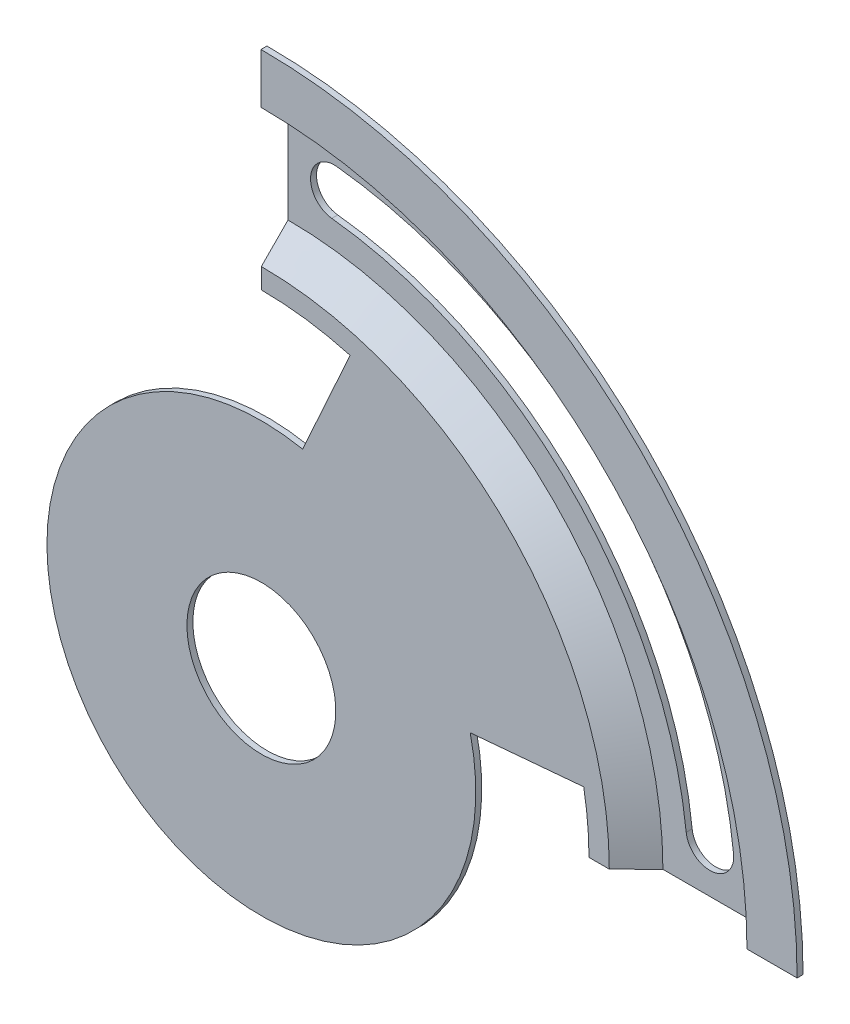
ISO-10303-21;
HEADER;
FILE_DESCRIPTION(('STEP AP214'),'2;1');
FILE_NAME('part.step','',(''),(''),'','','');
FILE_SCHEMA(('AUTOMOTIVE_DESIGN { 1 0 10303 214 1 1 1 1 }'));
ENDSEC;
DATA;
#1=APPLICATION_CONTEXT('core data for automotive mechanical design processes');
#2=APPLICATION_PROTOCOL_DEFINITION('international standard','automotive_design',2000,#1);
#3=PRODUCT_CONTEXT('',#1,'mechanical');
#4=PRODUCT('Part','Part','',(#3));
#5=PRODUCT_RELATED_PRODUCT_CATEGORY('part','',(#4));
#6=PRODUCT_DEFINITION_FORMATION('','',#4);
#7=PRODUCT_DEFINITION_CONTEXT('part definition',#1,'design');
#8=PRODUCT_DEFINITION('design','',#6,#7);
#9=PRODUCT_DEFINITION_SHAPE('','',#8);
#10=(LENGTH_UNIT() NAMED_UNIT(*) SI_UNIT(.MILLI.,.METRE.));
#11=(NAMED_UNIT(*) PLANE_ANGLE_UNIT() SI_UNIT($,.RADIAN.));
#12=(NAMED_UNIT(*) SI_UNIT($,.STERADIAN.) SOLID_ANGLE_UNIT());
#13=UNCERTAINTY_MEASURE_WITH_UNIT(LENGTH_MEASURE(1.E-05),#10,'distance_accuracy_value','');
#14=(GEOMETRIC_REPRESENTATION_CONTEXT(3) GLOBAL_UNCERTAINTY_ASSIGNED_CONTEXT((#13)) GLOBAL_UNIT_ASSIGNED_CONTEXT((#10,
#11,#12)) REPRESENTATION_CONTEXT('',''));
#15=CARTESIAN_POINT('',(0.,0.,0.));
#16=DIRECTION('',(0.,0.,1.));
#17=DIRECTION('',(1.,0.,0.));
#18=AXIS2_PLACEMENT_3D('',#15,#16,#17);
#19=CARTESIAN_POINT('',(-74.2716777212826,74.2716777212823,14.2371794871795));
#20=DIRECTION('',(0.,0.,1.));
#21=DIRECTION('',(1.,0.,0.));
#22=AXIS2_PLACEMENT_3D('',#19,#20,#21);
#23=PLANE('',#22);
#24=CARTESIAN_POINT('',(-74.2716777212823,0.,14.2371794871795));
#25=DIRECTION('',(0.,0.,-1.));
#26=DIRECTION('',(-1.,0.,0.));
#27=AXIS2_PLACEMENT_3D('',#24,#25,#26);
#28=CIRCLE('',#27,77.1120746125061);
#29=CARTESIAN_POINT('',(-74.2716777212826,77.1120746125061,14.2371794871795));
#30=VERTEX_POINT('',#29);
#31=CARTESIAN_POINT('',(2.84039689122376,0.,14.2371794871795));
#32=VERTEX_POINT('',#31);
#33=EDGE_CURVE('E216',#30,#32,#28,.T.);
#34=ORIENTED_EDGE('',*,*,#33,.F.);
#35=DIRECTION('',(0.,-1.,0.));
#36=VECTOR('',#35,1.);
#37=CARTESIAN_POINT('',(-74.2716777212826,74.2716777212823,14.2371794871795));
#38=LINE('',#37,#36);
#39=CARTESIAN_POINT('',(-74.2716777212826,62.940512664491,14.2371794871795));
#40=VERTEX_POINT('',#39);
#41=EDGE_CURVE('E268',#30,#40,#38,.T.);
#42=ORIENTED_EDGE('',*,*,#41,.T.);
#43=CARTESIAN_POINT('',(-74.2716777212823,0.,14.2371794871795));
#44=DIRECTION('',(0.,0.,-1.));
#45=DIRECTION('',(-1.,0.,0.));
#46=AXIS2_PLACEMENT_3D('',#43,#44,#45);
#47=CIRCLE('',#46,62.940512664491);
#48=CARTESIAN_POINT('',(-11.3311650567913,0.,14.2371794871795));
#49=VERTEX_POINT('',#48);
#50=EDGE_CURVE('E213',#40,#49,#47,.T.);
#51=ORIENTED_EDGE('',*,*,#50,.T.);
#52=DIRECTION('',(-1.,0.,0.));
#53=VECTOR('',#52,1.);
#54=CARTESIAN_POINT('',(0.,0.,14.2371794871795));
#55=LINE('',#54,#53);
#56=EDGE_CURVE('E316',#32,#49,#55,.T.);
#57=ORIENTED_EDGE('',*,*,#56,.F.);
#58=EDGE_LOOP('',(#34,#42,#51,#57));
#59=FACE_BOUND('',#58,.T.);
#60=CARTESIAN_POINT('',(-74.2716777212824,0.,14.2371794871795));
#61=DIRECTION('',(0.,0.,1.));
#62=DIRECTION('',(1.,0.,0.));
#63=AXIS2_PLACEMENT_3D('',#60,#61,#62);
#64=CIRCLE('',#63,75.2533607990788);
#65=CARTESIAN_POINT('',(0.549212140260685,8.05622441862127,14.2371794871795));
#66=VERTEX_POINT('',#65);
#67=CARTESIAN_POINT('',(-66.2154533026613,74.820889861543,14.2371794871795));
#68=VERTEX_POINT('',#67);
#69=EDGE_CURVE('E384',#66,#68,#64,.T.);
#70=ORIENTED_EDGE('',*,*,#69,.F.);
#71=CARTESIAN_POINT('',(-3.44347065533568,7.78773298835838,14.2371794871795));
#72=DIRECTION('',(0.,0.,1.));
#73=DIRECTION('',(1.,0.,0.));
#74=AXIS2_PLACEMENT_3D('',#71,#72,#73);
#75=CIRCLE('',#74,4.00170008301169);
#76=CARTESIAN_POINT('',(-7.4211937682571,7.35032883736475,14.2371794871795));
#77=VERTEX_POINT('',#76);
#78=EDGE_CURVE('E377',#66,#77,#75,.F.);
#79=ORIENTED_EDGE('',*,*,#78,.T.);
#80=CARTESIAN_POINT('',(-74.2716777212824,0.,14.2371794871795));
#81=DIRECTION('',(0.,0.,1.));
#82=DIRECTION('',(1.,0.,0.));
#83=AXIS2_PLACEMENT_3D('',#80,#81,#82);
#84=CIRCLE('',#83,67.2533607990788);
#85=CARTESIAN_POINT('',(-66.9213488839178,66.8504839530253,14.2371794871795));
#86=VERTEX_POINT('',#85);
#87=EDGE_CURVE('E389',#77,#86,#84,.T.);
#88=ORIENTED_EDGE('',*,*,#87,.T.);
#89=CARTESIAN_POINT('',(-66.4839447329242,70.8282070659467,14.2371794871795));
#90=DIRECTION('',(0.,0.,1.));
#91=DIRECTION('',(1.,0.,0.));
#92=AXIS2_PLACEMENT_3D('',#89,#90,#91);
#93=CIRCLE('',#92,4.00170008301169);
#94=EDGE_CURVE('E189',#68,#86,#93,.T.);
#95=ORIENTED_EDGE('',*,*,#94,.F.);
#96=EDGE_LOOP('',(#70,#79,#88,#95));
#97=FACE_BOUND('',#96,.T.);
#98=ADVANCED_FACE('F41',(#59,#97),#23,.T.);
#99=CARTESIAN_POINT('',(-74.2716777212826,74.2716777212823,13.2371794871795));
#100=DIRECTION('',(0.,0.,1.));
#101=DIRECTION('',(1.,0.,0.));
#102=AXIS2_PLACEMENT_3D('',#99,#100,#101);
#103=PLANE('',#102);
#104=CARTESIAN_POINT('',(-74.2716777212823,0.,13.2371794871795));
#105=DIRECTION('',(0.,0.,-1.));
#106=DIRECTION('',(-1.,0.,0.));
#107=AXIS2_PLACEMENT_3D('',#104,#105,#106);
#108=CIRCLE('',#107,62.5302247298292);
#109=CARTESIAN_POINT('',(-74.2716777212826,62.5302247298293,13.2371794871795));
#110=VERTEX_POINT('',#109);
#111=CARTESIAN_POINT('',(-11.741452991453,0.,13.2371794871795));
#112=VERTEX_POINT('',#111);
#113=EDGE_CURVE('E234',#110,#112,#108,.T.);
#114=ORIENTED_EDGE('',*,*,#113,.F.);
#115=DIRECTION('',(0.,-1.,0.));
#116=VECTOR('',#115,1.);
#117=CARTESIAN_POINT('',(-74.2716777212826,74.2716777212823,13.2371794871795));
#118=LINE('',#117,#116);
#119=CARTESIAN_POINT('',(-74.2716777212826,77.5302247298293,13.2371794871796));
#120=VERTEX_POINT('',#119);
#121=EDGE_CURVE('E244',#120,#110,#118,.T.);
#122=ORIENTED_EDGE('',*,*,#121,.F.);
#123=CARTESIAN_POINT('',(-74.2716777212823,0.,13.2371794871796));
#124=DIRECTION('',(0.,0.,-1.));
#125=DIRECTION('',(-1.,0.,0.));
#126=AXIS2_PLACEMENT_3D('',#123,#124,#125);
#127=CIRCLE('',#126,77.5302247298292);
#128=CARTESIAN_POINT('',(3.25854700854697,0.,13.2371794871795));
#129=VERTEX_POINT('',#128);
#130=EDGE_CURVE('E231',#120,#129,#127,.T.);
#131=ORIENTED_EDGE('',*,*,#130,.T.);
#132=DIRECTION('',(-1.,0.,0.));
#133=VECTOR('',#132,1.);
#134=CARTESIAN_POINT('',(0.,0.,13.2371794871795));
#135=LINE('',#134,#133);
#136=EDGE_CURVE('E292',#129,#112,#135,.T.);
#137=ORIENTED_EDGE('',*,*,#136,.T.);
#138=EDGE_LOOP('',(#114,#122,#131,#137));
#139=FACE_BOUND('',#138,.T.);
#140=CARTESIAN_POINT('',(-3.44347065533568,7.78773298835838,13.2371794871795));
#141=DIRECTION('',(0.,0.,1.));
#142=DIRECTION('',(1.,0.,0.));
#143=AXIS2_PLACEMENT_3D('',#140,#141,#142);
#144=CIRCLE('',#143,4.00170008301169);
#145=CARTESIAN_POINT('',(0.549212140260671,8.05622441862128,13.2371794871795));
#146=VERTEX_POINT('',#145);
#147=CARTESIAN_POINT('',(-7.4211937682571,7.35032883736475,13.2371794871795));
#148=VERTEX_POINT('',#147);
#149=EDGE_CURVE('E11',#146,#148,#144,.F.);
#150=ORIENTED_EDGE('',*,*,#149,.F.);
#151=CARTESIAN_POINT('',(-74.2716777212824,0.,13.2371794871795));
#152=DIRECTION('',(0.,0.,1.));
#153=DIRECTION('',(1.,0.,0.));
#154=AXIS2_PLACEMENT_3D('',#151,#152,#153);
#155=CIRCLE('',#154,75.2533607990788);
#156=CARTESIAN_POINT('',(-66.2154533026613,74.820889861543,13.2371794871795));
#157=VERTEX_POINT('',#156);
#158=EDGE_CURVE('E50',#146,#157,#155,.T.);
#159=ORIENTED_EDGE('',*,*,#158,.T.);
#160=CARTESIAN_POINT('',(-66.4839447329242,70.8282070659467,13.2371794871795));
#161=DIRECTION('',(0.,0.,1.));
#162=DIRECTION('',(1.,0.,0.));
#163=AXIS2_PLACEMENT_3D('',#160,#161,#162);
#164=CIRCLE('',#163,4.00170008301169);
#165=CARTESIAN_POINT('',(-66.9213488839178,66.8504839530253,13.2371794871795));
#166=VERTEX_POINT('',#165);
#167=EDGE_CURVE('E181',#157,#166,#164,.T.);
#168=ORIENTED_EDGE('',*,*,#167,.T.);
#169=CARTESIAN_POINT('',(-74.2716777212824,0.,13.2371794871795));
#170=DIRECTION('',(0.,0.,1.));
#171=DIRECTION('',(1.,0.,0.));
#172=AXIS2_PLACEMENT_3D('',#169,#170,#171);
#173=CIRCLE('',#172,67.2533607990788);
#174=EDGE_CURVE('E175',#148,#166,#173,.T.);
#175=ORIENTED_EDGE('',*,*,#174,.F.);
#176=EDGE_LOOP('',(#150,#159,#168,#175));
#177=FACE_BOUND('',#176,.T.);
#178=ADVANCED_FACE('F195',(#139,#177),#103,.F.);
#179=CARTESIAN_POINT('',(-74.2716777212823,0.,17.7069547573503));
#180=DIRECTION('',(0.,0.,-1.));
#181=DIRECTION('',(-1.,0.,0.));
#182=AXIS2_PLACEMENT_3D('',#179,#180,#181);
#183=CYLINDRICAL_SURFACE('',#182,55.0000521120331);
#184=CARTESIAN_POINT('',(-74.2716777212823,0.,18.7069547573503));
#185=DIRECTION('',(0.,0.,-1.));
#186=DIRECTION('',(-1.,0.,0.));
#187=AXIS2_PLACEMENT_3D('',#184,#185,#186);
#188=CIRCLE('',#187,55.0000521120331);
#189=CARTESIAN_POINT('',(-20.1559547401785,9.82314911618428,18.7069547573502));
#190=VERTEX_POINT('',#189);
#191=CARTESIAN_POINT('',(-19.2716256092492,0.,18.7069547573502));
#192=VERTEX_POINT('',#191);
#193=EDGE_CURVE('E209',#190,#192,#188,.T.);
#194=ORIENTED_EDGE('',*,*,#193,.F.);
#195=DIRECTION('',(0.,0.,-1.));
#196=VECTOR('',#195,1.);
#197=CARTESIAN_POINT('',(-20.1559547401785,9.82314911618429,18.7069547573502));
#198=LINE('',#197,#196);
#199=CARTESIAN_POINT('',(-20.1559547401785,9.82314911618429,17.7069547573502));
#200=VERTEX_POINT('',#199);
#201=EDGE_CURVE('E344',#190,#200,#198,.T.);
#202=ORIENTED_EDGE('',*,*,#201,.T.);
#203=CARTESIAN_POINT('',(-74.2716777212823,0.,17.7069547573503));
#204=DIRECTION('',(0.,0.,-1.));
#205=DIRECTION('',(-1.,0.,0.));
#206=AXIS2_PLACEMENT_3D('',#203,#204,#205);
#207=CIRCLE('',#206,55.0000521120331);
#208=CARTESIAN_POINT('',(-19.2716256092492,0.,17.7069547573502));
#209=VERTEX_POINT('',#208);
#210=EDGE_CURVE('E204',#200,#209,#207,.T.);
#211=ORIENTED_EDGE('',*,*,#210,.T.);
#212=DIRECTION('',(0.,0.,1.));
#213=VECTOR('',#212,1.);
#214=CARTESIAN_POINT('',(-19.2716256092492,0.,0.));
#215=LINE('',#214,#213);
#216=EDGE_CURVE('E328',#209,#192,#215,.T.);
#217=ORIENTED_EDGE('',*,*,#216,.T.);
#218=EDGE_LOOP('',(#194,#202,#211,#217));
#219=FACE_BOUND('',#218,.T.);
#220=ADVANCED_FACE('F413',(#219),#183,.F.);
#221=CARTESIAN_POINT('',(-74.2716777212826,74.2716777212823,17.7069547573503));
#222=DIRECTION('',(0.,0.,1.));
#223=DIRECTION('',(1.,0.,0.));
#224=AXIS2_PLACEMENT_3D('',#221,#222,#223);
#225=PLANE('',#224);
#226=CARTESIAN_POINT('',(-74.2716777212825,55.0000521120331,17.7069547573503));
#227=VERTEX_POINT('',#226);
#228=CARTESIAN_POINT('',(-59.3717429626267,52.9433440246663,17.7069547573503));
#229=VERTEX_POINT('',#228);
#230=EDGE_CURVE('E182',#227,#229,#207,.T.);
#231=ORIENTED_EDGE('',*,*,#230,.F.);
#232=DIRECTION('',(0.,-1.,0.));
#233=VECTOR('',#232,1.);
#234=CARTESIAN_POINT('',(-74.2716777212826,74.2716777212823,17.7069547573503));
#235=LINE('',#234,#233);
#236=CARTESIAN_POINT('',(-74.2716777212825,58.0000521120331,17.7069547573503));
#237=VERTEX_POINT('',#236);
#238=EDGE_CURVE('E284',#237,#227,#235,.T.);
#239=ORIENTED_EDGE('',*,*,#238,.F.);
#240=CARTESIAN_POINT('',(-74.2716777212823,0.,17.7069547573503));
#241=DIRECTION('',(0.,0.,-1.));
#242=DIRECTION('',(-1.,0.,0.));
#243=AXIS2_PLACEMENT_3D('',#240,#241,#242);
#244=CIRCLE('',#243,58.0000521120331);
#245=CARTESIAN_POINT('',(-16.2716256092492,0.,17.7069547573502));
#246=VERTEX_POINT('',#245);
#247=EDGE_CURVE('E237',#237,#246,#244,.T.);
#248=ORIENTED_EDGE('',*,*,#247,.T.);
#249=DIRECTION('',(-1.,0.,0.));
#250=VECTOR('',#249,1.);
#251=CARTESIAN_POINT('',(0.,0.,17.7069547573502));
#252=LINE('',#251,#250);
#253=EDGE_CURVE('E332',#246,#209,#252,.T.);
#254=ORIENTED_EDGE('',*,*,#253,.T.);
#255=ORIENTED_EDGE('',*,*,#210,.F.);
#256=DIRECTION('',(-0.996200421618735,-0.0870902977756768,0.));
#257=VECTOR('',#256,1.);
#258=CARTESIAN_POINT('',(-39.2081045606857,8.15756319077519,17.7069547573503));
#259=LINE('',#258,#257);
#260=CARTESIAN_POINT('',(-39.2081045606857,8.15756319077519,17.7069547573503));
#261=VERTEX_POINT('',#260);
#262=EDGE_CURVE('E350',#200,#261,#259,.T.);
#263=ORIENTED_EDGE('',*,*,#262,.T.);
#264=CARTESIAN_POINT('',(-74.2716777212823,0.,17.7069547573503));
#265=DIRECTION('',(0.,0.,-1.));
#266=DIRECTION('',(-1.,0.,0.));
#267=AXIS2_PLACEMENT_3D('',#264,#265,#266);
#268=CIRCLE('',#267,36.);
#269=CARTESIAN_POINT('',(-67.3429790735951,35.3269463023559,17.7069547573503));
#270=VERTEX_POINT('',#269);
#271=EDGE_CURVE('E359',#261,#270,#268,.T.);
#272=ORIENTED_EDGE('',*,*,#271,.T.);
#273=DIRECTION('',(0.412250010118188,0.911070759687499,0.));
#274=VECTOR('',#273,1.);
#275=CARTESIAN_POINT('',(-67.3429790735951,35.3269463023559,17.7069547573503));
#276=LINE('',#275,#274);
#277=EDGE_CURVE('E355',#270,#229,#276,.T.);
#278=ORIENTED_EDGE('',*,*,#277,.T.);
#279=EDGE_LOOP('',(#231,#239,#248,#254,#255,#263,#272,#278));
#280=FACE_BOUND('',#279,.T.);
#281=CARTESIAN_POINT('',(-74.2716777212823,0.,17.7069547573503));
#282=DIRECTION('',(0.,0.,-1.));
#283=DIRECTION('',(-1.,0.,0.));
#284=AXIS2_PLACEMENT_3D('',#281,#282,#283);
#285=CIRCLE('',#284,12.5);
#286=CARTESIAN_POINT('',(-86.7716777212823,0.,17.7069547573503));
#287=VERTEX_POINT('',#286);
#288=EDGE_CURVE('E373',#287,#287,#285,.T.);
#289=ORIENTED_EDGE('',*,*,#288,.F.);
#290=EDGE_LOOP('',(#289));
#291=FACE_BOUND('',#290,.T.);
#292=ADVANCED_FACE('F429',(#280,#291),#225,.F.);
#293=ORIENTED_EDGE('',*,*,#230,.T.);
#294=DIRECTION('',(0.,0.,-1.));
#295=VECTOR('',#294,1.);
#296=CARTESIAN_POINT('',(-59.3717429626267,52.9433440246663,18.7069547573503));
#297=LINE('',#296,#295);
#298=CARTESIAN_POINT('',(-59.3717429626267,52.9433440246663,18.7069547573503));
#299=VERTEX_POINT('',#298);
#300=EDGE_CURVE('E340',#299,#229,#297,.T.);
#301=ORIENTED_EDGE('',*,*,#300,.F.);
#302=CARTESIAN_POINT('',(-74.2716777212825,55.0000521120331,18.7069547573503));
#303=VERTEX_POINT('',#302);
#304=EDGE_CURVE('E205',#303,#299,#188,.T.);
#305=ORIENTED_EDGE('',*,*,#304,.F.);
#306=DIRECTION('',(0.,0.,1.));
#307=VECTOR('',#306,1.);
#308=CARTESIAN_POINT('',(-74.2716777212825,55.0000521120331,0.));
#309=LINE('',#308,#307);
#310=EDGE_CURVE('E280',#227,#303,#309,.T.);
#311=ORIENTED_EDGE('',*,*,#310,.F.);
#312=EDGE_LOOP('',(#293,#301,#305,#311));
#313=FACE_BOUND('',#312,.T.);
#314=ADVANCED_FACE('F43',(#313),#183,.F.);
#315=CARTESIAN_POINT('',(-74.2716777212826,74.2716777212823,18.7069547573503));
#316=DIRECTION('',(0.,0.,1.));
#317=DIRECTION('',(1.,0.,0.));
#318=AXIS2_PLACEMENT_3D('',#315,#316,#317);
#319=PLANE('',#318);
#320=CARTESIAN_POINT('',(-74.2716777212823,0.,18.7069547573503));
#321=DIRECTION('',(0.,0.,-1.));
#322=DIRECTION('',(-1.,0.,0.));
#323=AXIS2_PLACEMENT_3D('',#320,#321,#322);
#324=CIRCLE('',#323,58.4103400466948);
#325=CARTESIAN_POINT('',(-74.2716777212826,58.4103400466949,18.7069547573503));
#326=VERTEX_POINT('',#325);
#327=CARTESIAN_POINT('',(-15.8613376745875,0.,18.7069547573502));
#328=VERTEX_POINT('',#327);
#329=EDGE_CURVE('E210',#326,#328,#324,.T.);
#330=ORIENTED_EDGE('',*,*,#329,.F.);
#331=DIRECTION('',(0.,-1.,0.));
#332=VECTOR('',#331,1.);
#333=CARTESIAN_POINT('',(-74.2716777212826,74.2716777212823,18.7069547573503));
#334=LINE('',#333,#332);
#335=EDGE_CURVE('E276',#326,#303,#334,.T.);
#336=ORIENTED_EDGE('',*,*,#335,.T.);
#337=ORIENTED_EDGE('',*,*,#304,.T.);
#338=DIRECTION('',(0.412250010118188,0.911070759687499,0.));
#339=VECTOR('',#338,1.);
#340=CARTESIAN_POINT('',(-67.3429790735951,35.3269463023559,18.7069547573503));
#341=LINE('',#340,#339);
#342=CARTESIAN_POINT('',(-67.3429790735951,35.3269463023559,18.7069547573503));
#343=VERTEX_POINT('',#342);
#344=EDGE_CURVE('E367',#343,#299,#341,.T.);
#345=ORIENTED_EDGE('',*,*,#344,.F.);
#346=CARTESIAN_POINT('',(-74.2716777212823,0.,18.7069547573503));
#347=DIRECTION('',(0.,0.,-1.));
#348=DIRECTION('',(-1.,0.,0.));
#349=AXIS2_PLACEMENT_3D('',#346,#347,#348);
#350=CIRCLE('',#349,36.);
#351=CARTESIAN_POINT('',(-39.2081045606857,8.15756319077519,18.7069547573503));
#352=VERTEX_POINT('',#351);
#353=EDGE_CURVE('E354',#352,#343,#350,.T.);
#354=ORIENTED_EDGE('',*,*,#353,.F.);
#355=DIRECTION('',(-0.996200421618735,-0.0870902977756768,0.));
#356=VECTOR('',#355,1.);
#357=CARTESIAN_POINT('',(-39.2081045606857,8.15756319077519,18.7069547573503));
#358=LINE('',#357,#356);
#359=EDGE_CURVE('E341',#190,#352,#358,.T.);
#360=ORIENTED_EDGE('',*,*,#359,.F.);
#361=ORIENTED_EDGE('',*,*,#193,.T.);
#362=DIRECTION('',(-1.,0.,0.));
#363=VECTOR('',#362,1.);
#364=CARTESIAN_POINT('',(0.,0.,18.7069547573502));
#365=LINE('',#364,#363);
#366=EDGE_CURVE('E324',#328,#192,#365,.T.);
#367=ORIENTED_EDGE('',*,*,#366,.F.);
#368=EDGE_LOOP('',(#330,#336,#337,#345,#354,#360,#361,#367));
#369=FACE_BOUND('',#368,.T.);
#370=CARTESIAN_POINT('',(-74.2716777212823,0.,18.7069547573503));
#371=DIRECTION('',(0.,0.,-1.));
#372=DIRECTION('',(-1.,0.,0.));
#373=AXIS2_PLACEMENT_3D('',#370,#371,#372);
#374=CIRCLE('',#373,12.5);
#375=CARTESIAN_POINT('',(-86.7716777212823,0.,18.7069547573503));
#376=VERTEX_POINT('',#375);
#377=EDGE_CURVE('E363',#376,#376,#374,.T.);
#378=ORIENTED_EDGE('',*,*,#377,.T.);
#379=EDGE_LOOP('',(#378));
#380=FACE_BOUND('',#379,.T.);
#381=ADVANCED_FACE('F422',(#369,#380),#319,.T.);
#382=CARTESIAN_POINT('',(-74.2716777212823,0.,14.2371794871795));
#383=DIRECTION('',(0.,0.,-1.));
#384=DIRECTION('',(-1.,0.,0.));
#385=AXIS2_PLACEMENT_3D('',#382,#383,#384);
#386=CONICAL_SURFACE('',#385,62.940512664491,0.792108917917943);
#387=ORIENTED_EDGE('',*,*,#50,.F.);
#388=DIRECTION('',(0.,-0.711836043655105,0.70234567483074));
#389=VECTOR('',#388,1.);
#390=CARTESIAN_POINT('',(-74.2716777212826,75.8000821699319,1.54905684596668));
#391=LINE('',#390,#389);
#392=EDGE_CURVE('E272',#40,#326,#391,.T.);
#393=ORIENTED_EDGE('',*,*,#392,.T.);
#394=ORIENTED_EDGE('',*,*,#329,.T.);
#395=DIRECTION('',(-0.711836043655105,0.,0.702345674830741));
#396=VECTOR('',#395,1.);
#397=CARTESIAN_POINT('',(1.52840444864961,0.,1.54905684596662));
#398=LINE('',#397,#396);
#399=EDGE_CURVE('E320',#49,#328,#398,.T.);
#400=ORIENTED_EDGE('',*,*,#399,.F.);
#401=EDGE_LOOP('',(#387,#393,#394,#400));
#402=FACE_BOUND('',#401,.T.);
#403=ADVANCED_FACE('F420',(#402),#386,.T.);
#404=CARTESIAN_POINT('',(-74.2716777212823,0.,18.7673521049757));
#405=DIRECTION('',(0.,0.,1.));
#406=DIRECTION('',(1.,0.,0.));
#407=AXIS2_PLACEMENT_3D('',#404,#405,#406);
#408=CONICAL_SURFACE('',#407,81.5818498826768,0.778687408876952);
#409=CARTESIAN_POINT('',(-74.2716777212823,0.,18.7673521049757));
#410=DIRECTION('',(0.,0.,-1.));
#411=DIRECTION('',(-1.,0.,0.));
#412=AXIS2_PLACEMENT_3D('',#409,#410,#411);
#413=CIRCLE('',#412,81.5818498826768);
#414=CARTESIAN_POINT('',(-74.2716777212826,81.5818498826769,18.7673521049757));
#415=VERTEX_POINT('',#414);
#416=CARTESIAN_POINT('',(7.31017216139455,0.,18.7673521049757));
#417=VERTEX_POINT('',#416);
#418=EDGE_CURVE('E219',#415,#417,#413,.T.);
#419=ORIENTED_EDGE('',*,*,#418,.F.);
#420=DIRECTION('',(0.,-0.702345674830741,-0.711836043655105));
#421=VECTOR('',#420,1.);
#422=CARTESIAN_POINT('',(-74.2716777212826,68.5929882080536,5.60297986295188));
#423=LINE('',#422,#421);
#424=EDGE_CURVE('E264',#415,#30,#423,.T.);
#425=ORIENTED_EDGE('',*,*,#424,.T.);
#426=ORIENTED_EDGE('',*,*,#33,.T.);
#427=DIRECTION('',(-0.702345674830741,0.,-0.711836043655104));
#428=VECTOR('',#427,1.);
#429=CARTESIAN_POINT('',(-5.67868951322874,0.,5.60297986295188));
#430=LINE('',#429,#428);
#431=EDGE_CURVE('E312',#417,#32,#430,.T.);
#432=ORIENTED_EDGE('',*,*,#431,.F.);
#433=EDGE_LOOP('',(#419,#425,#426,#432));
#434=FACE_BOUND('',#433,.T.);
#435=ADVANCED_FACE('F418',(#434),#408,.F.);
#436=CARTESIAN_POINT('',(-74.2716777212826,74.2716777212823,18.7673521049757));
#437=DIRECTION('',(0.,0.,1.));
#438=DIRECTION('',(1.,0.,0.));
#439=AXIS2_PLACEMENT_3D('',#436,#437,#438);
#440=PLANE('',#439);
#441=CARTESIAN_POINT('',(-74.2716777212823,0.,18.7673521049757));
#442=DIRECTION('',(0.,0.,-1.));
#443=DIRECTION('',(-1.,0.,0.));
#444=AXIS2_PLACEMENT_3D('',#441,#442,#443);
#445=CIRCLE('',#444,90.);
#446=CARTESIAN_POINT('',(-74.2716777212827,90.0000000000001,18.7673521049757));
#447=VERTEX_POINT('',#446);
#448=CARTESIAN_POINT('',(15.7283222787177,0.,18.7673521049757));
#449=VERTEX_POINT('',#448);
#450=EDGE_CURVE('E222',#447,#449,#445,.T.);
#451=ORIENTED_EDGE('',*,*,#450,.F.);
#452=DIRECTION('',(0.,-1.,0.));
#453=VECTOR('',#452,1.);
#454=CARTESIAN_POINT('',(-74.2716777212826,74.2716777212823,18.7673521049757));
#455=LINE('',#454,#453);
#456=EDGE_CURVE('E260',#447,#415,#455,.T.);
#457=ORIENTED_EDGE('',*,*,#456,.T.);
#458=ORIENTED_EDGE('',*,*,#418,.T.);
#459=DIRECTION('',(-1.,0.,0.));
#460=VECTOR('',#459,1.);
#461=CARTESIAN_POINT('',(0.,0.,18.7673521049757));
#462=LINE('',#461,#460);
#463=EDGE_CURVE('E308',#449,#417,#462,.T.);
#464=ORIENTED_EDGE('',*,*,#463,.F.);
#465=EDGE_LOOP('',(#451,#457,#458,#464));
#466=FACE_BOUND('',#465,.T.);
#467=ADVANCED_FACE('F468',(#466),#440,.T.);
#468=CARTESIAN_POINT('',(-74.2716777212823,0.,17.7069547573503));
#469=DIRECTION('',(0.,0.,-1.));
#470=DIRECTION('',(-1.,0.,0.));
#471=AXIS2_PLACEMENT_3D('',#468,#469,#470);
#472=CYLINDRICAL_SURFACE('',#471,90.);
#473=CARTESIAN_POINT('',(-74.2716777212823,0.,17.7673521049757));
#474=DIRECTION('',(0.,0.,-1.));
#475=DIRECTION('',(-1.,0.,0.));
#476=AXIS2_PLACEMENT_3D('',#473,#474,#475);
#477=CIRCLE('',#476,90.);
#478=CARTESIAN_POINT('',(-74.2716777212827,90.0000000000001,17.7673521049757));
#479=VERTEX_POINT('',#478);
#480=CARTESIAN_POINT('',(15.7283222787177,0.,17.7673521049757));
#481=VERTEX_POINT('',#480);
#482=EDGE_CURVE('E225',#479,#481,#477,.T.);
#483=ORIENTED_EDGE('',*,*,#482,.F.);
#484=DIRECTION('',(0.,0.,1.));
#485=VECTOR('',#484,1.);
#486=CARTESIAN_POINT('',(-74.2716777212827,90.0000000000001,0.));
#487=LINE('',#486,#485);
#488=EDGE_CURVE('E256',#479,#447,#487,.T.);
#489=ORIENTED_EDGE('',*,*,#488,.T.);
#490=ORIENTED_EDGE('',*,*,#450,.T.);
#491=DIRECTION('',(0.,0.,1.));
#492=VECTOR('',#491,1.);
#493=CARTESIAN_POINT('',(15.7283222787178,0.,0.));
#494=LINE('',#493,#492);
#495=EDGE_CURVE('E304',#481,#449,#494,.T.);
#496=ORIENTED_EDGE('',*,*,#495,.F.);
#497=EDGE_LOOP('',(#483,#489,#490,#496));
#498=FACE_BOUND('',#497,.T.);
#499=ADVANCED_FACE('F465',(#498),#472,.T.);
#500=CARTESIAN_POINT('',(-74.2716777212826,74.2716777212823,17.7673521049757));
#501=DIRECTION('',(0.,0.,1.));
#502=DIRECTION('',(1.,0.,0.));
#503=AXIS2_PLACEMENT_3D('',#500,#501,#502);
#504=PLANE('',#503);
#505=CARTESIAN_POINT('',(-74.2716777212823,0.,17.7673521049757));
#506=DIRECTION('',(0.,0.,-1.));
#507=DIRECTION('',(-1.,0.,0.));
#508=AXIS2_PLACEMENT_3D('',#505,#506,#507);
#509=CIRCLE('',#508,82.);
#510=CARTESIAN_POINT('',(-74.2716777212826,82.0000000000001,17.7673521049757));
#511=VERTEX_POINT('',#510);
#512=CARTESIAN_POINT('',(7.72832227871772,0.,17.7673521049757));
#513=VERTEX_POINT('',#512);
#514=EDGE_CURVE('E228',#511,#513,#509,.T.);
#515=ORIENTED_EDGE('',*,*,#514,.F.);
#516=DIRECTION('',(0.,-1.,0.));
#517=VECTOR('',#516,1.);
#518=CARTESIAN_POINT('',(-74.2716777212826,74.2716777212823,17.7673521049757));
#519=LINE('',#518,#517);
#520=EDGE_CURVE('E252',#479,#511,#519,.T.);
#521=ORIENTED_EDGE('',*,*,#520,.F.);
#522=ORIENTED_EDGE('',*,*,#482,.T.);
#523=DIRECTION('',(-1.,0.,0.));
#524=VECTOR('',#523,1.);
#525=CARTESIAN_POINT('',(0.,0.,17.7673521049757));
#526=LINE('',#525,#524);
#527=EDGE_CURVE('E300',#481,#513,#526,.T.);
#528=ORIENTED_EDGE('',*,*,#527,.T.);
#529=EDGE_LOOP('',(#515,#521,#522,#528));
#530=FACE_BOUND('',#529,.T.);
#531=ADVANCED_FACE('F461',(#530),#504,.F.);
#532=CARTESIAN_POINT('',(-74.2716777212823,0.,17.7673521049757));
#533=DIRECTION('',(0.,0.,1.));
#534=DIRECTION('',(1.,0.,0.));
#535=AXIS2_PLACEMENT_3D('',#532,#533,#534);
#536=CONICAL_SURFACE('',#535,82.,0.778687408876953);
#537=ORIENTED_EDGE('',*,*,#130,.F.);
#538=DIRECTION('',(0.,-0.702345674830741,-0.711836043655105));
#539=VECTOR('',#538,1.);
#540=CARTESIAN_POINT('',(-74.2716777212826,69.3048242517087,4.90063418812114));
#541=LINE('',#540,#539);
#542=EDGE_CURVE('E248',#511,#120,#541,.T.);
#543=ORIENTED_EDGE('',*,*,#542,.F.);
#544=ORIENTED_EDGE('',*,*,#514,.T.);
#545=DIRECTION('',(-0.702345674830741,0.,-0.711836043655104));
#546=VECTOR('',#545,1.);
#547=CARTESIAN_POINT('',(-4.96685346957364,0.,4.90063418812114));
#548=LINE('',#547,#546);
#549=EDGE_CURVE('E296',#513,#129,#548,.T.);
#550=ORIENTED_EDGE('',*,*,#549,.T.);
#551=EDGE_LOOP('',(#537,#543,#544,#550));
#552=FACE_BOUND('',#551,.T.);
#553=ADVANCED_FACE('F456',(#552),#536,.T.);
#554=CARTESIAN_POINT('',(-74.2716777212823,0.,13.2371794871795));
#555=DIRECTION('',(0.,0.,-1.));
#556=DIRECTION('',(-1.,0.,0.));
#557=AXIS2_PLACEMENT_3D('',#554,#555,#556);
#558=CONICAL_SURFACE('',#557,62.5302247298292,0.792108917917945);
#559=DIRECTION('',(0.,-0.711836043655105,0.70234567483074));
#560=VECTOR('',#559,1.);
#561=CARTESIAN_POINT('',(-74.2716777212826,75.0977364951012,0.837220802311578));
#562=LINE('',#561,#560);
#563=EDGE_CURVE('E240',#110,#237,#562,.T.);
#564=ORIENTED_EDGE('',*,*,#563,.F.);
#565=ORIENTED_EDGE('',*,*,#113,.T.);
#566=DIRECTION('',(-0.711836043655105,0.,0.702345674830741));
#567=VECTOR('',#566,1.);
#568=CARTESIAN_POINT('',(0.826058773818861,0.,0.837220802311522));
#569=LINE('',#568,#567);
#570=EDGE_CURVE('E288',#112,#246,#569,.T.);
#571=ORIENTED_EDGE('',*,*,#570,.T.);
#572=ORIENTED_EDGE('',*,*,#247,.F.);
#573=EDGE_LOOP('',(#564,#565,#571,#572));
#574=FACE_BOUND('',#573,.T.);
#575=ADVANCED_FACE('F454',(#574),#558,.F.);
#576=CARTESIAN_POINT('',(-74.2716777212826,74.2716777212823,0.));
#577=DIRECTION('',(-1.,0.,0.));
#578=DIRECTION('',(0.,0.,1.));
#579=AXIS2_PLACEMENT_3D('',#576,#577,#578);
#580=PLANE('',#579);
#581=ORIENTED_EDGE('',*,*,#238,.T.);
#582=ORIENTED_EDGE('',*,*,#310,.T.);
#583=ORIENTED_EDGE('',*,*,#335,.F.);
#584=ORIENTED_EDGE('',*,*,#392,.F.);
#585=ORIENTED_EDGE('',*,*,#41,.F.);
#586=ORIENTED_EDGE('',*,*,#424,.F.);
#587=ORIENTED_EDGE('',*,*,#456,.F.);
#588=ORIENTED_EDGE('',*,*,#488,.F.);
#589=ORIENTED_EDGE('',*,*,#520,.T.);
#590=ORIENTED_EDGE('',*,*,#542,.T.);
#591=ORIENTED_EDGE('',*,*,#121,.T.);
#592=ORIENTED_EDGE('',*,*,#563,.T.);
#593=EDGE_LOOP('',(#581,#582,#583,#584,#585,#586,#587,#588,#589,#590,#591,#592));
#594=FACE_BOUND('',#593,.T.);
#595=ADVANCED_FACE('F452',(#594),#580,.T.);
#596=CARTESIAN_POINT('',(0.,0.,0.));
#597=DIRECTION('',(0.,1.,0.));
#598=DIRECTION('',(0.,0.,1.));
#599=AXIS2_PLACEMENT_3D('',#596,#597,#598);
#600=PLANE('',#599);
#601=ORIENTED_EDGE('',*,*,#253,.F.);
#602=ORIENTED_EDGE('',*,*,#570,.F.);
#603=ORIENTED_EDGE('',*,*,#136,.F.);
#604=ORIENTED_EDGE('',*,*,#549,.F.);
#605=ORIENTED_EDGE('',*,*,#527,.F.);
#606=ORIENTED_EDGE('',*,*,#495,.T.);
#607=ORIENTED_EDGE('',*,*,#463,.T.);
#608=ORIENTED_EDGE('',*,*,#431,.T.);
#609=ORIENTED_EDGE('',*,*,#56,.T.);
#610=ORIENTED_EDGE('',*,*,#399,.T.);
#611=ORIENTED_EDGE('',*,*,#366,.T.);
#612=ORIENTED_EDGE('',*,*,#216,.F.);
#613=EDGE_LOOP('',(#601,#602,#603,#604,#605,#606,#607,#608,#609,#610,#611,#612));
#614=FACE_BOUND('',#613,.T.);
#615=ADVANCED_FACE('F502',(#614),#600,.F.);
#616=CARTESIAN_POINT('',(-74.2716777212823,0.,18.7069547573503));
#617=DIRECTION('',(0.,0.,-1.));
#618=DIRECTION('',(-1.,0.,0.));
#619=AXIS2_PLACEMENT_3D('',#616,#617,#618);
#620=CYLINDRICAL_SURFACE('',#619,36.);
#621=ORIENTED_EDGE('',*,*,#271,.F.);
#622=DIRECTION('',(0.,0.,-1.));
#623=VECTOR('',#622,1.);
#624=CARTESIAN_POINT('',(-39.2081045606857,8.15756319077519,18.7069547573503));
#625=LINE('',#624,#623);
#626=EDGE_CURVE('E336',#352,#261,#625,.T.);
#627=ORIENTED_EDGE('',*,*,#626,.F.);
#628=ORIENTED_EDGE('',*,*,#353,.T.);
#629=DIRECTION('',(0.,0.,-1.));
#630=VECTOR('',#629,1.);
#631=CARTESIAN_POINT('',(-67.3429790735951,35.3269463023559,18.7069547573503));
#632=LINE('',#631,#630);
#633=EDGE_CURVE('E337',#343,#270,#632,.T.);
#634=ORIENTED_EDGE('',*,*,#633,.T.);
#635=EDGE_LOOP('',(#621,#627,#628,#634));
#636=FACE_BOUND('',#635,.T.);
#637=ADVANCED_FACE('F567',(#636),#620,.T.);
#638=CARTESIAN_POINT('',(-39.2081045606857,8.15756319077519,18.7069547573503));
#639=DIRECTION('',(0.0870902977756769,-0.996200421618735,0.));
#640=DIRECTION('',(0.996200421618735,0.0870902977756769,0.));
#641=AXIS2_PLACEMENT_3D('',#638,#639,#640);
#642=PLANE('',#641);
#643=ORIENTED_EDGE('',*,*,#262,.F.);
#644=ORIENTED_EDGE('',*,*,#201,.F.);
#645=ORIENTED_EDGE('',*,*,#359,.T.);
#646=ORIENTED_EDGE('',*,*,#626,.T.);
#647=EDGE_LOOP('',(#643,#644,#645,#646));
#648=FACE_BOUND('',#647,.T.);
#649=ADVANCED_FACE('F564',(#648),#642,.T.);
#650=CARTESIAN_POINT('',(-67.3429790735951,35.3269463023559,18.7069547573503));
#651=DIRECTION('',(-0.911070759687499,0.412250010118188,0.));
#652=DIRECTION('',(-0.412250010118188,-0.911070759687499,0.));
#653=AXIS2_PLACEMENT_3D('',#650,#651,#652);
#654=PLANE('',#653);
#655=ORIENTED_EDGE('',*,*,#277,.F.);
#656=ORIENTED_EDGE('',*,*,#633,.F.);
#657=ORIENTED_EDGE('',*,*,#344,.T.);
#658=ORIENTED_EDGE('',*,*,#300,.T.);
#659=EDGE_LOOP('',(#655,#656,#657,#658));
#660=FACE_BOUND('',#659,.T.);
#661=ADVANCED_FACE('F439',(#660),#654,.T.);
#662=CARTESIAN_POINT('',(-74.2716777212823,0.,18.7069547573503));
#663=DIRECTION('',(0.,0.,-1.));
#664=DIRECTION('',(-1.,0.,0.));
#665=AXIS2_PLACEMENT_3D('',#662,#663,#664);
#666=CYLINDRICAL_SURFACE('',#665,12.5);
#667=ORIENTED_EDGE('',*,*,#377,.F.);
#668=EDGE_LOOP('',(#667));
#669=FACE_BOUND('',#668,.T.);
#670=ORIENTED_EDGE('',*,*,#288,.T.);
#671=EDGE_LOOP('',(#670));
#672=FACE_BOUND('',#671,.T.);
#673=ADVANCED_FACE('F436',(#669,#672),#666,.F.);
#674=CARTESIAN_POINT('',(-3.44347065533568,7.78773298835838,18.7673521049757));
#675=DIRECTION('',(0.,0.,-1.));
#676=DIRECTION('',(-1.,0.,0.));
#677=AXIS2_PLACEMENT_3D('',#674,#675,#676);
#678=CYLINDRICAL_SURFACE('',#677,4.00170008301169);
#679=DIRECTION('',(0.,0.,-1.));
#680=VECTOR('',#679,1.);
#681=CARTESIAN_POINT('',(0.549212140260685,8.05622441862126,18.7673521049757));
#682=LINE('',#681,#680);
#683=EDGE_CURVE('E392',#66,#146,#682,.T.);
#684=ORIENTED_EDGE('',*,*,#683,.T.);
#685=ORIENTED_EDGE('',*,*,#149,.T.);
#686=DIRECTION('',(0.,0.,-1.));
#687=VECTOR('',#686,1.);
#688=CARTESIAN_POINT('',(-7.42119376825712,7.35032883736475,18.7673521049757));
#689=LINE('',#688,#687);
#690=EDGE_CURVE('E62',#77,#148,#689,.T.);
#691=ORIENTED_EDGE('',*,*,#690,.F.);
#692=ORIENTED_EDGE('',*,*,#78,.F.);
#693=EDGE_LOOP('',(#684,#685,#691,#692));
#694=FACE_BOUND('',#693,.T.);
#695=ADVANCED_FACE('F402',(#694),#678,.F.);
#696=CARTESIAN_POINT('',(-74.2716777212823,0.,18.7673521049757));
#697=DIRECTION('',(0.,0.,-1.));
#698=DIRECTION('',(-1.,0.,0.));
#699=AXIS2_PLACEMENT_3D('',#696,#697,#698);
#700=CYLINDRICAL_SURFACE('',#699,75.2533607990788);
#701=ORIENTED_EDGE('',*,*,#69,.T.);
#702=DIRECTION('',(0.,0.,-1.));
#703=VECTOR('',#702,1.);
#704=CARTESIAN_POINT('',(-66.2154533026613,74.8208898615431,18.7673521049757));
#705=LINE('',#704,#703);
#706=EDGE_CURVE('E192',#68,#157,#705,.T.);
#707=ORIENTED_EDGE('',*,*,#706,.T.);
#708=ORIENTED_EDGE('',*,*,#158,.F.);
#709=ORIENTED_EDGE('',*,*,#683,.F.);
#710=EDGE_LOOP('',(#701,#707,#708,#709));
#711=FACE_BOUND('',#710,.T.);
#712=ADVANCED_FACE('F405',(#711),#700,.F.);
#713=CARTESIAN_POINT('',(-66.4839447329242,70.8282070659467,18.7673521049757));
#714=DIRECTION('',(0.,0.,-1.));
#715=DIRECTION('',(-1.,0.,0.));
#716=AXIS2_PLACEMENT_3D('',#713,#714,#715);
#717=CYLINDRICAL_SURFACE('',#716,4.00170008301169);
#718=ORIENTED_EDGE('',*,*,#94,.T.);
#719=DIRECTION('',(0.,0.,-1.));
#720=VECTOR('',#719,1.);
#721=CARTESIAN_POINT('',(-66.9213488839178,66.8504839530253,18.7673521049757));
#722=LINE('',#721,#720);
#723=EDGE_CURVE('E57',#86,#166,#722,.T.);
#724=ORIENTED_EDGE('',*,*,#723,.T.);
#725=ORIENTED_EDGE('',*,*,#167,.F.);
#726=ORIENTED_EDGE('',*,*,#706,.F.);
#727=EDGE_LOOP('',(#718,#724,#725,#726));
#728=FACE_BOUND('',#727,.T.);
#729=ADVANCED_FACE('F185',(#728),#717,.F.);
#730=CARTESIAN_POINT('',(-74.2716777212823,0.,18.7673521049757));
#731=DIRECTION('',(0.,0.,-1.));
#732=DIRECTION('',(-1.,0.,0.));
#733=AXIS2_PLACEMENT_3D('',#730,#731,#732);
#734=CYLINDRICAL_SURFACE('',#733,67.2533607990788);
#735=ORIENTED_EDGE('',*,*,#690,.T.);
#736=ORIENTED_EDGE('',*,*,#174,.T.);
#737=ORIENTED_EDGE('',*,*,#723,.F.);
#738=ORIENTED_EDGE('',*,*,#87,.F.);
#739=EDGE_LOOP('',(#735,#736,#737,#738));
#740=FACE_BOUND('',#739,.T.);
#741=ADVANCED_FACE('F176',(#740),#734,.T.);
#742=CLOSED_SHELL('',(#98,#178,#220,#292,#314,#381,#403,#435,#467,#499,#531,#553,#575,#595,#615,
#637,#649,#661,#673,#695,#712,#729,#741));
#743=MANIFOLD_SOLID_BREP('B2',#742);
#744=ADVANCED_BREP_SHAPE_REPRESENTATION('',(#18,#743),#14);
#745=SHAPE_DEFINITION_REPRESENTATION(#9,#744);
ENDSEC;
END-ISO-10303-21;
